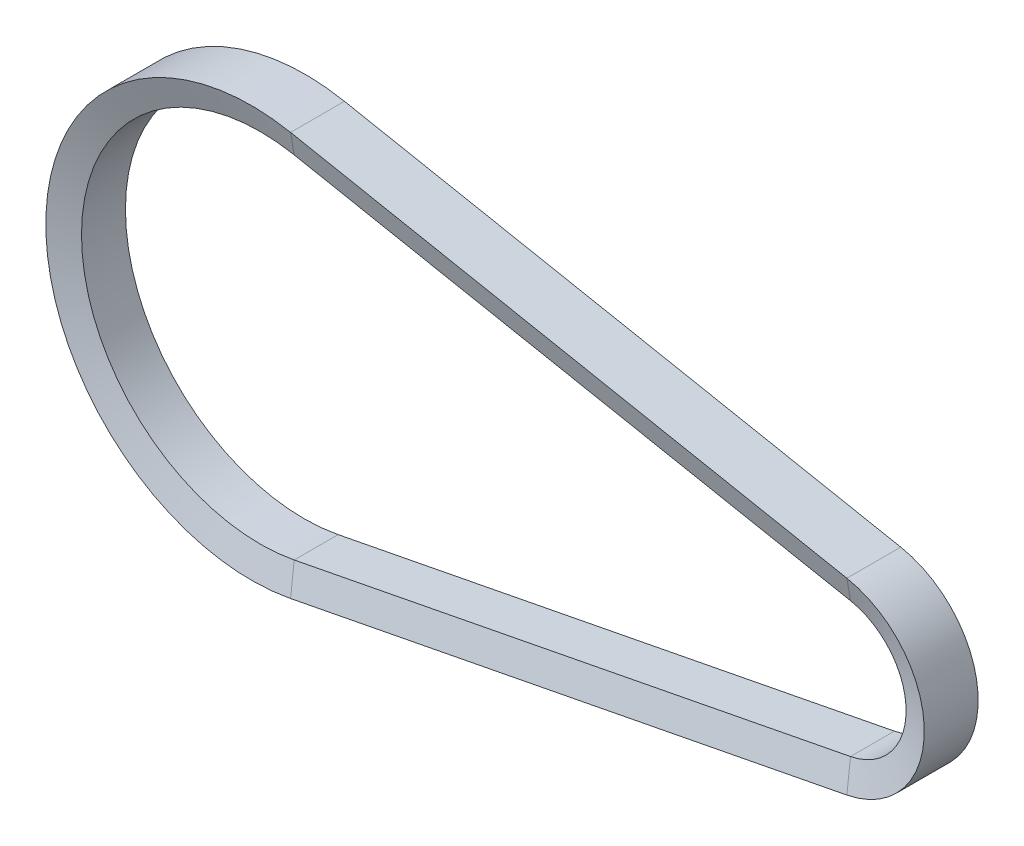
ISO-10303-21;
HEADER;
FILE_DESCRIPTION(('STEP AP214'),'2;1');
FILE_NAME('part.step','',(''),(''),'','','');
FILE_SCHEMA(('AUTOMOTIVE_DESIGN { 1 0 10303 214 1 1 1 1 }'));
ENDSEC;
DATA;
#1=APPLICATION_CONTEXT('core data for automotive mechanical design processes');
#2=APPLICATION_PROTOCOL_DEFINITION('international standard','automotive_design',2000,#1);
#3=PRODUCT_CONTEXT('',#1,'mechanical');
#4=PRODUCT('Part','Part','',(#3));
#5=PRODUCT_RELATED_PRODUCT_CATEGORY('part','',(#4));
#6=PRODUCT_DEFINITION_FORMATION('','',#4);
#7=PRODUCT_DEFINITION_CONTEXT('part definition',#1,'design');
#8=PRODUCT_DEFINITION('design','',#6,#7);
#9=PRODUCT_DEFINITION_SHAPE('','',#8);
#10=(LENGTH_UNIT() NAMED_UNIT(*) SI_UNIT(.MILLI.,.METRE.));
#11=(NAMED_UNIT(*) PLANE_ANGLE_UNIT() SI_UNIT($,.RADIAN.));
#12=(NAMED_UNIT(*) SI_UNIT($,.STERADIAN.) SOLID_ANGLE_UNIT());
#13=UNCERTAINTY_MEASURE_WITH_UNIT(LENGTH_MEASURE(1.E-05),#10,'distance_accuracy_value','');
#14=(GEOMETRIC_REPRESENTATION_CONTEXT(3) GLOBAL_UNCERTAINTY_ASSIGNED_CONTEXT((#13)) GLOBAL_UNIT_ASSIGNED_CONTEXT((#10,
#11,#12)) REPRESENTATION_CONTEXT('',''));
#15=CARTESIAN_POINT('',(0.,0.,0.));
#16=DIRECTION('',(0.,0.,1.));
#17=DIRECTION('',(1.,0.,0.));
#18=AXIS2_PLACEMENT_3D('',#15,#16,#17);
#19=CARTESIAN_POINT('',(0.,0.,19.6));
#20=DIRECTION('',(0.,0.,-1.));
#21=DIRECTION('',(-1.,0.,0.));
#22=AXIS2_PLACEMENT_3D('',#19,#20,#21);
#23=CYLINDRICAL_SURFACE('',#22,74.8);
#24=CARTESIAN_POINT('',(0.,0.,0.));
#25=DIRECTION('',(0.,0.,1.));
#26=DIRECTION('',(1.,0.,0.));
#27=AXIS2_PLACEMENT_3D('',#24,#25,#26);
#28=CIRCLE('',#27,74.8);
#29=CARTESIAN_POINT('',(14.247619047619,73.4305478086193,0.));
#30=VERTEX_POINT('',#29);
#31=CARTESIAN_POINT('',(14.2476190476191,-73.4305478086193,0.));
#32=VERTEX_POINT('',#31);
#33=EDGE_CURVE('E131',#30,#32,#28,.T.);
#34=ORIENTED_EDGE('',*,*,#33,.T.);
#35=DIRECTION('',(0.,0.,-1.));
#36=VECTOR('',#35,1.);
#37=CARTESIAN_POINT('',(14.2476190476191,-73.4305478086193,19.6));
#38=LINE('',#37,#36);
#39=CARTESIAN_POINT('',(14.2476190476191,-73.4305478086193,19.6));
#40=VERTEX_POINT('',#39);
#41=EDGE_CURVE('E114',#40,#32,#38,.T.);
#42=ORIENTED_EDGE('',*,*,#41,.F.);
#43=CARTESIAN_POINT('',(0.,0.,19.6));
#44=DIRECTION('',(0.,0.,1.));
#45=DIRECTION('',(1.,0.,0.));
#46=AXIS2_PLACEMENT_3D('',#43,#44,#45);
#47=CIRCLE('',#46,74.8);
#48=CARTESIAN_POINT('',(14.247619047619,73.4305478086193,19.6));
#49=VERTEX_POINT('',#48);
#50=EDGE_CURVE('E123',#49,#40,#47,.T.);
#51=ORIENTED_EDGE('',*,*,#50,.F.);
#52=DIRECTION('',(0.,0.,-1.));
#53=VECTOR('',#52,1.);
#54=CARTESIAN_POINT('',(14.247619047619,73.4305478086193,19.6));
#55=LINE('',#54,#53);
#56=EDGE_CURVE('E192',#49,#30,#55,.T.);
#57=ORIENTED_EDGE('',*,*,#56,.T.);
#58=EDGE_LOOP('',(#34,#42,#51,#57));
#59=FACE_BOUND('',#58,.T.);
#60=ADVANCED_FACE('F43',(#59),#23,.T.);
#61=CARTESIAN_POINT('',(14.2476190476191,-73.4305478086193,19.6));
#62=DIRECTION('',(-0.190476190476191,0.981691815623253,0.));
#63=DIRECTION('',(-0.981691815623253,-0.190476190476191,0.));
#64=AXIS2_PLACEMENT_3D('',#61,#62,#63);
#65=PLANE('',#64);
#66=DIRECTION('',(0.981691815623252,0.190476190476191,0.));
#67=VECTOR('',#66,1.);
#68=CARTESIAN_POINT('',(14.2476190476191,-73.4305478086193,0.));
#69=LINE('',#68,#67);
#70=CARTESIAN_POINT('',(216.628571428571,-34.1628751836892,0.));
#71=VERTEX_POINT('',#70);
#72=EDGE_CURVE('E199',#32,#71,#69,.T.);
#73=ORIENTED_EDGE('',*,*,#72,.T.);
#74=DIRECTION('',(0.,0.,-1.));
#75=VECTOR('',#74,1.);
#76=CARTESIAN_POINT('',(216.628571428571,-34.1628751836892,19.6));
#77=LINE('',#76,#75);
#78=CARTESIAN_POINT('',(216.628571428571,-34.1628751836892,19.6));
#79=VERTEX_POINT('',#78);
#80=EDGE_CURVE('E117',#79,#71,#77,.T.);
#81=ORIENTED_EDGE('',*,*,#80,.F.);
#82=DIRECTION('',(0.981691815623252,0.190476190476191,0.));
#83=VECTOR('',#82,1.);
#84=CARTESIAN_POINT('',(14.2476190476191,-73.4305478086193,19.6));
#85=LINE('',#84,#83);
#86=EDGE_CURVE('E111',#40,#79,#85,.T.);
#87=ORIENTED_EDGE('',*,*,#86,.F.);
#88=ORIENTED_EDGE('',*,*,#41,.T.);
#89=EDGE_LOOP('',(#73,#81,#87,#88));
#90=FACE_BOUND('',#89,.T.);
#91=ADVANCED_FACE('F113',(#90),#65,.F.);
#92=CARTESIAN_POINT('',(210.,0.,19.6));
#93=DIRECTION('',(0.,0.,-1.));
#94=DIRECTION('',(-1.,0.,0.));
#95=AXIS2_PLACEMENT_3D('',#92,#93,#94);
#96=CYLINDRICAL_SURFACE('',#95,34.8);
#97=CARTESIAN_POINT('',(210.,0.,0.));
#98=DIRECTION('',(0.,0.,1.));
#99=DIRECTION('',(1.,0.,0.));
#100=AXIS2_PLACEMENT_3D('',#97,#98,#99);
#101=CIRCLE('',#100,34.8);
#102=CARTESIAN_POINT('',(216.628571428571,34.1628751836892,0.));
#103=VERTEX_POINT('',#102);
#104=EDGE_CURVE('E196',#71,#103,#101,.T.);
#105=ORIENTED_EDGE('',*,*,#104,.T.);
#106=DIRECTION('',(0.,0.,-1.));
#107=VECTOR('',#106,1.);
#108=CARTESIAN_POINT('',(216.628571428571,34.1628751836892,19.6));
#109=LINE('',#108,#107);
#110=CARTESIAN_POINT('',(216.628571428571,34.1628751836892,19.6));
#111=VERTEX_POINT('',#110);
#112=EDGE_CURVE('E189',#111,#103,#109,.T.);
#113=ORIENTED_EDGE('',*,*,#112,.F.);
#114=CARTESIAN_POINT('',(210.,0.,19.6));
#115=DIRECTION('',(0.,0.,1.));
#116=DIRECTION('',(1.,0.,0.));
#117=AXIS2_PLACEMENT_3D('',#114,#115,#116);
#118=CIRCLE('',#117,34.8);
#119=EDGE_CURVE('E122',#79,#111,#118,.T.);
#120=ORIENTED_EDGE('',*,*,#119,.F.);
#121=ORIENTED_EDGE('',*,*,#80,.T.);
#122=EDGE_LOOP('',(#105,#113,#120,#121));
#123=FACE_BOUND('',#122,.T.);
#124=ADVANCED_FACE('F223',(#123),#96,.T.);
#125=CARTESIAN_POINT('',(14.247619047619,73.4305478086193,19.6));
#126=DIRECTION('',(-0.19047619047619,-0.981691815623252,0.));
#127=DIRECTION('',(0.981691815623253,-0.19047619047619,0.));
#128=AXIS2_PLACEMENT_3D('',#125,#126,#127);
#129=PLANE('',#128);
#130=DIRECTION('',(-0.981691815623253,0.19047619047619,0.));
#131=VECTOR('',#130,1.);
#132=CARTESIAN_POINT('',(14.247619047619,73.4305478086193,0.));
#133=LINE('',#132,#131);
#134=EDGE_CURVE('E144',#103,#30,#133,.T.);
#135=ORIENTED_EDGE('',*,*,#134,.T.);
#136=ORIENTED_EDGE('',*,*,#56,.F.);
#137=DIRECTION('',(-0.981691815623253,0.19047619047619,0.));
#138=VECTOR('',#137,1.);
#139=CARTESIAN_POINT('',(14.247619047619,73.4305478086193,19.6));
#140=LINE('',#139,#138);
#141=EDGE_CURVE('E194',#111,#49,#140,.T.);
#142=ORIENTED_EDGE('',*,*,#141,.F.);
#143=ORIENTED_EDGE('',*,*,#112,.T.);
#144=EDGE_LOOP('',(#135,#136,#142,#143));
#145=FACE_BOUND('',#144,.T.);
#146=ADVANCED_FACE('F225',(#145),#129,.F.);
#147=CARTESIAN_POINT('',(0.,0.,19.6));
#148=DIRECTION('',(0.,0.,-1.));
#149=DIRECTION('',(-1.,0.,0.));
#150=AXIS2_PLACEMENT_3D('',#147,#148,#149);
#151=CYLINDRICAL_SURFACE('',#150,65.);
#152=DIRECTION('',(0.,0.,-1.));
#153=VECTOR('',#152,1.);
#154=CARTESIAN_POINT('',(12.3809523809524,-63.8099680155114,19.6));
#155=LINE('',#154,#153);
#156=CARTESIAN_POINT('',(12.3809523809524,-63.8099680155114,16.4157869769175));
#157=VERTEX_POINT('',#156);
#158=CARTESIAN_POINT('',(12.3809523809524,-63.8099680155114,0.427877240503416));
#159=VERTEX_POINT('',#158);
#160=EDGE_CURVE('E202',#157,#159,#155,.T.);
#161=ORIENTED_EDGE('',*,*,#160,.T.);
#162=CARTESIAN_POINT('',(0.,0.,0.427877240503416));
#163=DIRECTION('',(0.,0.,1.));
#164=DIRECTION('',(1.,0.,0.));
#165=AXIS2_PLACEMENT_3D('',#162,#163,#164);
#166=CIRCLE('',#165,65.);
#167=CARTESIAN_POINT('',(12.3809523809524,63.8099680155114,0.427877240503416));
#168=VERTEX_POINT('',#167);
#169=EDGE_CURVE('E52',#159,#168,#166,.F.);
#170=ORIENTED_EDGE('',*,*,#169,.T.);
#171=DIRECTION('',(0.,0.,-1.));
#172=VECTOR('',#171,1.);
#173=CARTESIAN_POINT('',(12.3809523809524,63.8099680155114,19.6));
#174=LINE('',#173,#172);
#175=CARTESIAN_POINT('',(12.3809523809524,63.8099680155114,16.4157869769175));
#176=VERTEX_POINT('',#175);
#177=EDGE_CURVE('E148',#176,#168,#174,.T.);
#178=ORIENTED_EDGE('',*,*,#177,.F.);
#179=CARTESIAN_POINT('',(0.,0.,16.4157869769175));
#180=DIRECTION('',(0.,0.,1.));
#181=DIRECTION('',(1.,0.,0.));
#182=AXIS2_PLACEMENT_3D('',#179,#180,#181);
#183=CIRCLE('',#182,65.);
#184=EDGE_CURVE('E183',#176,#157,#183,.T.);
#185=ORIENTED_EDGE('',*,*,#184,.T.);
#186=EDGE_LOOP('',(#161,#170,#178,#185));
#187=FACE_BOUND('',#186,.T.);
#188=ADVANCED_FACE('F230',(#187),#151,.F.);
#189=CARTESIAN_POINT('',(12.3809523809524,-63.8099680155114,19.6));
#190=DIRECTION('',(-0.19047619047619,0.981691815623252,0.));
#191=DIRECTION('',(-0.981691815623253,-0.19047619047619,0.));
#192=AXIS2_PLACEMENT_3D('',#189,#190,#191);
#193=PLANE('',#192);
#194=DIRECTION('',(0.,0.,-1.));
#195=VECTOR('',#194,1.);
#196=CARTESIAN_POINT('',(214.761904761905,-24.5422953905813,19.6));
#197=LINE('',#196,#195);
#198=CARTESIAN_POINT('',(214.761904761905,-24.5422953905813,16.4157869769175));
#199=VERTEX_POINT('',#198);
#200=CARTESIAN_POINT('',(214.761904761905,-24.5422953905813,0.427877240503416));
#201=VERTEX_POINT('',#200);
#202=EDGE_CURVE('E206',#199,#201,#197,.T.);
#203=ORIENTED_EDGE('',*,*,#202,.T.);
#204=DIRECTION('',(-0.981691815623253,-0.19047619047619,0.));
#205=VECTOR('',#204,1.);
#206=CARTESIAN_POINT('',(12.3809523809524,-63.8099680155114,0.427877240503416));
#207=LINE('',#206,#205);
#208=EDGE_CURVE('E67',#201,#159,#207,.T.);
#209=ORIENTED_EDGE('',*,*,#208,.T.);
#210=ORIENTED_EDGE('',*,*,#160,.F.);
#211=DIRECTION('',(0.981691815623253,0.19047619047619,0.));
#212=VECTOR('',#211,1.);
#213=CARTESIAN_POINT('',(12.3809523809524,-63.8099680155114,16.4157869769175));
#214=LINE('',#213,#212);
#215=EDGE_CURVE('E147',#157,#199,#214,.T.);
#216=ORIENTED_EDGE('',*,*,#215,.T.);
#217=EDGE_LOOP('',(#203,#209,#210,#216));
#218=FACE_BOUND('',#217,.T.);
#219=ADVANCED_FACE('F231',(#218),#193,.T.);
#220=CARTESIAN_POINT('',(210.,0.,19.6));
#221=DIRECTION('',(0.,0.,-1.));
#222=DIRECTION('',(-1.,0.,0.));
#223=AXIS2_PLACEMENT_3D('',#220,#221,#222);
#224=CYLINDRICAL_SURFACE('',#223,25.);
#225=DIRECTION('',(0.,0.,-1.));
#226=VECTOR('',#225,1.);
#227=CARTESIAN_POINT('',(214.761904761905,24.5422953905813,19.6));
#228=LINE('',#227,#226);
#229=CARTESIAN_POINT('',(214.761904761905,24.5422953905813,16.4157869769175));
#230=VERTEX_POINT('',#229);
#231=CARTESIAN_POINT('',(214.761904761905,24.5422953905813,0.427877240503416));
#232=VERTEX_POINT('',#231);
#233=EDGE_CURVE('E150',#230,#232,#228,.T.);
#234=ORIENTED_EDGE('',*,*,#233,.T.);
#235=CARTESIAN_POINT('',(210.,0.,0.427877240503416));
#236=DIRECTION('',(0.,0.,1.));
#237=DIRECTION('',(1.,0.,0.));
#238=AXIS2_PLACEMENT_3D('',#235,#236,#237);
#239=CIRCLE('',#238,25.);
#240=EDGE_CURVE('E156',#232,#201,#239,.F.);
#241=ORIENTED_EDGE('',*,*,#240,.T.);
#242=ORIENTED_EDGE('',*,*,#202,.F.);
#243=CARTESIAN_POINT('',(210.,0.,16.4157869769175));
#244=DIRECTION('',(0.,0.,1.));
#245=DIRECTION('',(1.,0.,0.));
#246=AXIS2_PLACEMENT_3D('',#243,#244,#245);
#247=CIRCLE('',#246,25.);
#248=EDGE_CURVE('E133',#199,#230,#247,.T.);
#249=ORIENTED_EDGE('',*,*,#248,.T.);
#250=EDGE_LOOP('',(#234,#241,#242,#249));
#251=FACE_BOUND('',#250,.T.);
#252=ADVANCED_FACE('F212',(#251),#224,.F.);
#253=CARTESIAN_POINT('',(12.3809523809524,63.8099680155114,19.6));
#254=DIRECTION('',(-0.19047619047619,-0.981691815623252,0.));
#255=DIRECTION('',(0.981691815623253,-0.19047619047619,0.));
#256=AXIS2_PLACEMENT_3D('',#253,#254,#255);
#257=PLANE('',#256);
#258=ORIENTED_EDGE('',*,*,#177,.T.);
#259=DIRECTION('',(0.981691815623253,-0.19047619047619,0.));
#260=VECTOR('',#259,1.);
#261=CARTESIAN_POINT('',(214.761904761905,24.5422953905813,0.427877240503416));
#262=LINE('',#261,#260);
#263=EDGE_CURVE('E11',#168,#232,#262,.T.);
#264=ORIENTED_EDGE('',*,*,#263,.T.);
#265=ORIENTED_EDGE('',*,*,#233,.F.);
#266=DIRECTION('',(-0.981691815623253,0.19047619047619,0.));
#267=VECTOR('',#266,1.);
#268=CARTESIAN_POINT('',(12.3809523809524,63.8099680155114,16.4157869769175));
#269=LINE('',#268,#267);
#270=EDGE_CURVE('E159',#230,#176,#269,.T.);
#271=ORIENTED_EDGE('',*,*,#270,.T.);
#272=EDGE_LOOP('',(#258,#264,#265,#271));
#273=FACE_BOUND('',#272,.T.);
#274=ADVANCED_FACE('F229',(#273),#257,.T.);
#275=CARTESIAN_POINT('',(0.,0.,16.4157869769175));
#276=DIRECTION('',(0.,0.,1.));
#277=DIRECTION('',(1.,0.,0.));
#278=AXIS2_PLACEMENT_3D('',#275,#276,#277);
#279=CONICAL_SURFACE('',#278,65.,1.25663706143592);
#280=DIRECTION('',(-0.181153622151458,-0.933644398242115,-0.309016994374945));
#281=VECTOR('',#280,1.);
#282=CARTESIAN_POINT('',(14.2476190476191,73.4305478086195,19.6));
#283=LINE('',#282,#281);
#284=EDGE_CURVE('E142',#49,#176,#283,.T.);
#285=ORIENTED_EDGE('',*,*,#284,.F.);
#286=ORIENTED_EDGE('',*,*,#50,.T.);
#287=DIRECTION('',(0.181153622151458,-0.933644398242115,0.309016994374945));
#288=VECTOR('',#287,1.);
#289=CARTESIAN_POINT('',(12.3809523809524,-63.8099680155114,16.4157869769175));
#290=LINE('',#289,#288);
#291=EDGE_CURVE('E139',#157,#40,#290,.T.);
#292=ORIENTED_EDGE('',*,*,#291,.F.);
#293=ORIENTED_EDGE('',*,*,#184,.F.);
#294=EDGE_LOOP('',(#285,#286,#292,#293));
#295=FACE_BOUND('',#294,.T.);
#296=ADVANCED_FACE('F137',(#295),#279,.F.);
#297=CARTESIAN_POINT('',(12.3809523809524,-63.8099680155114,16.4157869769175));
#298=DIRECTION('',(0.058860379880942,-0.303359454266381,-0.951056516295154));
#299=DIRECTION('',(0.981691815623253,0.19047619047619,0.));
#300=AXIS2_PLACEMENT_3D('',#297,#298,#299);
#301=PLANE('',#300);
#302=ORIENTED_EDGE('',*,*,#291,.T.);
#303=ORIENTED_EDGE('',*,*,#86,.T.);
#304=DIRECTION('',(0.181153622151459,-0.933644398242115,0.309016994374945));
#305=VECTOR('',#304,1.);
#306=CARTESIAN_POINT('',(214.761904761905,-24.5422953905813,16.4157869769175));
#307=LINE('',#306,#305);
#308=EDGE_CURVE('E152',#199,#79,#307,.T.);
#309=ORIENTED_EDGE('',*,*,#308,.F.);
#310=ORIENTED_EDGE('',*,*,#215,.F.);
#311=EDGE_LOOP('',(#302,#303,#309,#310));
#312=FACE_BOUND('',#311,.T.);
#313=ADVANCED_FACE('F146',(#312),#301,.F.);
#314=CARTESIAN_POINT('',(12.3809523809524,63.8099680155114,16.4157869769175));
#315=DIRECTION('',(0.058860379880942,0.303359454266381,-0.951056516295154));
#316=DIRECTION('',(-0.981691815623253,0.19047619047619,0.));
#317=AXIS2_PLACEMENT_3D('',#314,#315,#316);
#318=PLANE('',#317);
#319=ORIENTED_EDGE('',*,*,#284,.T.);
#320=ORIENTED_EDGE('',*,*,#270,.F.);
#321=DIRECTION('',(-0.181153622151459,-0.933644398242115,-0.309016994374946));
#322=VECTOR('',#321,1.);
#323=CARTESIAN_POINT('',(216.628571428571,34.1628751836893,19.6));
#324=LINE('',#323,#322);
#325=EDGE_CURVE('E172',#111,#230,#324,.T.);
#326=ORIENTED_EDGE('',*,*,#325,.F.);
#327=ORIENTED_EDGE('',*,*,#141,.T.);
#328=EDGE_LOOP('',(#319,#320,#326,#327));
#329=FACE_BOUND('',#328,.T.);
#330=ADVANCED_FACE('F228',(#329),#318,.F.);
#331=CARTESIAN_POINT('',(210.,0.,16.4157869769175));
#332=DIRECTION('',(0.,0.,1.));
#333=DIRECTION('',(1.,0.,0.));
#334=AXIS2_PLACEMENT_3D('',#331,#332,#333);
#335=CONICAL_SURFACE('',#334,25.,1.25663706143592);
#336=ORIENTED_EDGE('',*,*,#308,.T.);
#337=ORIENTED_EDGE('',*,*,#119,.T.);
#338=ORIENTED_EDGE('',*,*,#325,.T.);
#339=ORIENTED_EDGE('',*,*,#248,.F.);
#340=EDGE_LOOP('',(#336,#337,#338,#339));
#341=FACE_BOUND('',#340,.T.);
#342=ADVANCED_FACE('F227',(#341),#335,.F.);
#343=CARTESIAN_POINT('',(0.,0.,0.));
#344=DIRECTION('',(0.,0.,-1.));
#345=DIRECTION('',(-1.,0.,0.));
#346=AXIS2_PLACEMENT_3D('',#343,#344,#345);
#347=CONICAL_SURFACE('',#346,74.8000000000008,1.52716309549504);
#348=DIRECTION('',(0.190294899348925,0.980757462539876,-0.0436193873653322));
#349=VECTOR('',#348,1.);
#350=CARTESIAN_POINT('',(12.3809523809524,63.8099680155114,0.427877240503416));
#351=LINE('',#350,#349);
#352=EDGE_CURVE('E165',#168,#30,#351,.T.);
#353=ORIENTED_EDGE('',*,*,#352,.F.);
#354=ORIENTED_EDGE('',*,*,#169,.F.);
#355=DIRECTION('',(-0.190294899348925,0.980757462539876,0.0436193873653322));
#356=VECTOR('',#355,1.);
#357=CARTESIAN_POINT('',(14.2476190476192,-73.4305478086201,0.));
#358=LINE('',#357,#356);
#359=EDGE_CURVE('E47',#32,#159,#358,.T.);
#360=ORIENTED_EDGE('',*,*,#359,.F.);
#361=ORIENTED_EDGE('',*,*,#33,.F.);
#362=EDGE_LOOP('',(#353,#354,#360,#361));
#363=FACE_BOUND('',#362,.T.);
#364=ADVANCED_FACE('F45',(#363),#347,.F.);
#365=CARTESIAN_POINT('',(14.2476190476192,-73.4305478086201,0.));
#366=DIRECTION('',(-0.00830845473625375,0.0428207955790469,-0.999048221581858));
#367=DIRECTION('',(-0.981691815623253,-0.19047619047619,0.));
#368=AXIS2_PLACEMENT_3D('',#365,#366,#367);
#369=PLANE('',#368);
#370=ORIENTED_EDGE('',*,*,#359,.T.);
#371=ORIENTED_EDGE('',*,*,#208,.F.);
#372=DIRECTION('',(-0.190294899348926,0.980757462539876,0.0436193873653322));
#373=VECTOR('',#372,1.);
#374=CARTESIAN_POINT('',(216.628571428572,-34.16287518369,0.));
#375=LINE('',#374,#373);
#376=EDGE_CURVE('E164',#71,#201,#375,.T.);
#377=ORIENTED_EDGE('',*,*,#376,.F.);
#378=ORIENTED_EDGE('',*,*,#72,.F.);
#379=EDGE_LOOP('',(#370,#371,#377,#378));
#380=FACE_BOUND('',#379,.T.);
#381=ADVANCED_FACE('F259',(#380),#369,.T.);
#382=CARTESIAN_POINT('',(14.2476190476192,73.4305478086201,0.));
#383=DIRECTION('',(-0.00830845473625375,-0.0428207955790469,-0.999048221581858));
#384=DIRECTION('',(0.981691815623253,-0.19047619047619,0.));
#385=AXIS2_PLACEMENT_3D('',#382,#383,#384);
#386=PLANE('',#385);
#387=ORIENTED_EDGE('',*,*,#352,.T.);
#388=ORIENTED_EDGE('',*,*,#134,.F.);
#389=DIRECTION('',(0.190294899348926,0.980757462539876,-0.0436193873653322));
#390=VECTOR('',#389,1.);
#391=CARTESIAN_POINT('',(214.761904761905,24.5422953905813,0.427877240503416));
#392=LINE('',#391,#390);
#393=EDGE_CURVE('E162',#232,#103,#392,.T.);
#394=ORIENTED_EDGE('',*,*,#393,.F.);
#395=ORIENTED_EDGE('',*,*,#263,.F.);
#396=EDGE_LOOP('',(#387,#388,#394,#395));
#397=FACE_BOUND('',#396,.T.);
#398=ADVANCED_FACE('F220',(#397),#386,.T.);
#399=CARTESIAN_POINT('',(210.,0.,0.));
#400=DIRECTION('',(0.,0.,-1.));
#401=DIRECTION('',(-1.,0.,0.));
#402=AXIS2_PLACEMENT_3D('',#399,#400,#401);
#403=CONICAL_SURFACE('',#402,34.8000000000008,1.52716309549504);
#404=ORIENTED_EDGE('',*,*,#376,.T.);
#405=ORIENTED_EDGE('',*,*,#240,.F.);
#406=ORIENTED_EDGE('',*,*,#393,.T.);
#407=ORIENTED_EDGE('',*,*,#104,.F.);
#408=EDGE_LOOP('',(#404,#405,#406,#407));
#409=FACE_BOUND('',#408,.T.);
#410=ADVANCED_FACE('F217',(#409),#403,.F.);
#411=CLOSED_SHELL('',(#60,#91,#124,#146,#188,#219,#252,#274,#296,#313,#330,#342,#364,#381,#398,#410));
#412=MANIFOLD_SOLID_BREP('B2',#411);
#413=ADVANCED_BREP_SHAPE_REPRESENTATION('',(#18,#412),#14);
#414=SHAPE_DEFINITION_REPRESENTATION(#9,#413);
ENDSEC;
END-ISO-10303-21;
